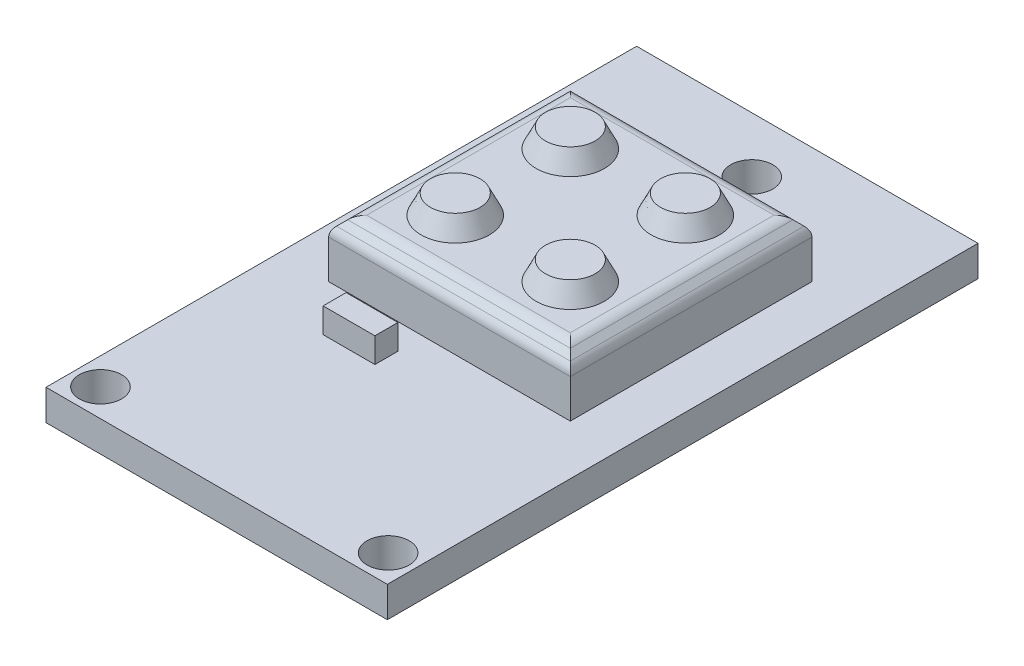
ISO-10303-21;
HEADER;
FILE_DESCRIPTION(('STEP AP214'),'2;1');
FILE_NAME('part.step','',(''),(''),'','','');
FILE_SCHEMA(('AUTOMOTIVE_DESIGN { 1 0 10303 214 1 1 1 1 }'));
ENDSEC;
DATA;
#1=APPLICATION_CONTEXT('core data for automotive mechanical design processes');
#2=APPLICATION_PROTOCOL_DEFINITION('international standard','automotive_design',2000,#1);
#3=PRODUCT_CONTEXT('',#1,'mechanical');
#4=PRODUCT('Part','Part','',(#3));
#5=PRODUCT_RELATED_PRODUCT_CATEGORY('part','',(#4));
#6=PRODUCT_DEFINITION_FORMATION('','',#4);
#7=PRODUCT_DEFINITION_CONTEXT('part definition',#1,'design');
#8=PRODUCT_DEFINITION('design','',#6,#7);
#9=PRODUCT_DEFINITION_SHAPE('','',#8);
#10=(LENGTH_UNIT() NAMED_UNIT(*) SI_UNIT(.MILLI.,.METRE.));
#11=(NAMED_UNIT(*) PLANE_ANGLE_UNIT() SI_UNIT($,.RADIAN.));
#12=(NAMED_UNIT(*) SI_UNIT($,.STERADIAN.) SOLID_ANGLE_UNIT());
#13=UNCERTAINTY_MEASURE_WITH_UNIT(LENGTH_MEASURE(1.E-05),#10,'distance_accuracy_value','');
#14=(GEOMETRIC_REPRESENTATION_CONTEXT(3) GLOBAL_UNCERTAINTY_ASSIGNED_CONTEXT((#13)) GLOBAL_UNIT_ASSIGNED_CONTEXT((#10,
#11,#12)) REPRESENTATION_CONTEXT('',''));
#15=CARTESIAN_POINT('',(0.,0.,0.));
#16=DIRECTION('',(0.,0.,1.));
#17=DIRECTION('',(1.,0.,0.));
#18=AXIS2_PLACEMENT_3D('',#15,#16,#17);
#19=CARTESIAN_POINT('',(0.,0.,0.));
#20=DIRECTION('',(0.,1.,0.));
#21=DIRECTION('',(0.,0.,1.));
#22=AXIS2_PLACEMENT_3D('',#19,#20,#21);
#23=PLANE('',#22);
#24=CARTESIAN_POINT('',(1.5,0.,-1.54));
#25=DIRECTION('',(0.,1.,0.));
#26=DIRECTION('',(0.,0.,1.));
#27=AXIS2_PLACEMENT_3D('',#24,#25,#26);
#28=CIRCLE('',#27,1.1);
#29=CARTESIAN_POINT('',(1.5,0.,-0.440000000000001));
#30=VERTEX_POINT('',#29);
#31=EDGE_CURVE('E223',#30,#30,#28,.T.);
#32=ORIENTED_EDGE('',*,*,#31,.F.);
#33=EDGE_LOOP('',(#32));
#34=FACE_BOUND('',#33,.T.);
#35=CARTESIAN_POINT('',(9.,0.,-28.));
#36=DIRECTION('',(0.,1.,0.));
#37=DIRECTION('',(0.,0.,1.));
#38=AXIS2_PLACEMENT_3D('',#35,#36,#37);
#39=CIRCLE('',#38,1.1);
#40=CARTESIAN_POINT('',(9.,0.,-26.9));
#41=VERTEX_POINT('',#40);
#42=EDGE_CURVE('E227',#41,#41,#39,.T.);
#43=ORIENTED_EDGE('',*,*,#42,.F.);
#44=EDGE_LOOP('',(#43));
#45=FACE_BOUND('',#44,.T.);
#46=CARTESIAN_POINT('',(16.5,0.,-1.54));
#47=DIRECTION('',(0.,1.,0.));
#48=DIRECTION('',(0.,0.,1.));
#49=AXIS2_PLACEMENT_3D('',#46,#47,#48);
#50=CIRCLE('',#49,1.1);
#51=CARTESIAN_POINT('',(16.5,0.,-0.440000000000001));
#52=VERTEX_POINT('',#51);
#53=EDGE_CURVE('E212',#52,#52,#50,.T.);
#54=ORIENTED_EDGE('',*,*,#53,.F.);
#55=EDGE_LOOP('',(#54));
#56=FACE_BOUND('',#55,.T.);
#57=DIRECTION('',(0.,0.,-1.));
#58=VECTOR('',#57,1.);
#59=CARTESIAN_POINT('',(0.100000000000002,0.,-30.9));
#60=LINE('',#59,#58);
#61=CARTESIAN_POINT('',(0.0999999999999994,0.,-0.100000000000003));
#62=VERTEX_POINT('',#61);
#63=CARTESIAN_POINT('',(0.100000000000002,0.,-30.9));
#64=VERTEX_POINT('',#63);
#65=EDGE_CURVE('E253',#62,#64,#60,.T.);
#66=ORIENTED_EDGE('',*,*,#65,.F.);
#67=DIRECTION('',(-1.,0.,0.));
#68=VECTOR('',#67,1.);
#69=CARTESIAN_POINT('',(0.0999999999999994,0.,-0.100000000000003));
#70=LINE('',#69,#68);
#71=CARTESIAN_POINT('',(17.9,0.,-0.100000000000003));
#72=VERTEX_POINT('',#71);
#73=EDGE_CURVE('E243',#72,#62,#70,.T.);
#74=ORIENTED_EDGE('',*,*,#73,.F.);
#75=DIRECTION('',(0.,0.,1.));
#76=VECTOR('',#75,1.);
#77=CARTESIAN_POINT('',(17.9,0.,-30.9));
#78=LINE('',#77,#76);
#79=CARTESIAN_POINT('',(17.9,0.,-30.9));
#80=VERTEX_POINT('',#79);
#81=EDGE_CURVE('E261',#80,#72,#78,.T.);
#82=ORIENTED_EDGE('',*,*,#81,.F.);
#83=DIRECTION('',(1.,0.,0.));
#84=VECTOR('',#83,1.);
#85=CARTESIAN_POINT('',(0.100000000000002,0.,-30.9));
#86=LINE('',#85,#84);
#87=EDGE_CURVE('E257',#64,#80,#86,.T.);
#88=ORIENTED_EDGE('',*,*,#87,.F.);
#89=EDGE_LOOP('',(#66,#74,#82,#88));
#90=FACE_BOUND('',#89,.T.);
#91=DIRECTION('',(0.,0.,1.));
#92=VECTOR('',#91,1.);
#93=CARTESIAN_POINT('',(2.7,0.,-12.24));
#94=LINE('',#93,#92);
#95=CARTESIAN_POINT('',(2.69999999999999,0.,-24.84));
#96=VERTEX_POINT('',#95);
#97=CARTESIAN_POINT('',(2.7,0.,-12.24));
#98=VERTEX_POINT('',#97);
#99=EDGE_CURVE('E311',#96,#98,#94,.T.);
#100=ORIENTED_EDGE('',*,*,#99,.F.);
#101=DIRECTION('',(-1.,0.,0.));
#102=VECTOR('',#101,1.);
#103=CARTESIAN_POINT('',(2.69999999999999,0.,-24.84));
#104=LINE('',#103,#102);
#105=CARTESIAN_POINT('',(15.3,0.,-24.84));
#106=VERTEX_POINT('',#105);
#107=EDGE_CURVE('E323',#106,#96,#104,.T.);
#108=ORIENTED_EDGE('',*,*,#107,.F.);
#109=DIRECTION('',(0.,0.,-1.));
#110=VECTOR('',#109,1.);
#111=CARTESIAN_POINT('',(15.3,0.,-12.24));
#112=LINE('',#111,#110);
#113=CARTESIAN_POINT('',(15.3,0.,-12.24));
#114=VERTEX_POINT('',#113);
#115=EDGE_CURVE('E319',#114,#106,#112,.T.);
#116=ORIENTED_EDGE('',*,*,#115,.F.);
#117=DIRECTION('',(1.,0.,0.));
#118=VECTOR('',#117,1.);
#119=CARTESIAN_POINT('',(2.7,0.,-12.24));
#120=LINE('',#119,#118);
#121=EDGE_CURVE('E315',#98,#114,#120,.T.);
#122=ORIENTED_EDGE('',*,*,#121,.F.);
#123=EDGE_LOOP('',(#100,#108,#116,#122));
#124=FACE_BOUND('',#123,.T.);
#125=DIRECTION('',(1.,0.,0.));
#126=VECTOR('',#125,1.);
#127=CARTESIAN_POINT('',(4.95,0.,-9.7));
#128=LINE('',#127,#126);
#129=CARTESIAN_POINT('',(4.95,0.,-9.7));
#130=VERTEX_POINT('',#129);
#131=CARTESIAN_POINT('',(7.65,0.,-9.7));
#132=VERTEX_POINT('',#131);
#133=EDGE_CURVE('E974',#130,#132,#128,.T.);
#134=ORIENTED_EDGE('',*,*,#133,.F.);
#135=DIRECTION('',(0.,0.,1.));
#136=VECTOR('',#135,1.);
#137=CARTESIAN_POINT('',(4.95,0.,-10.9));
#138=LINE('',#137,#136);
#139=CARTESIAN_POINT('',(4.95,0.,-10.9));
#140=VERTEX_POINT('',#139);
#141=EDGE_CURVE('E204',#140,#130,#138,.T.);
#142=ORIENTED_EDGE('',*,*,#141,.F.);
#143=DIRECTION('',(-1.,0.,0.));
#144=VECTOR('',#143,1.);
#145=CARTESIAN_POINT('',(4.95,0.,-10.9));
#146=LINE('',#145,#144);
#147=CARTESIAN_POINT('',(7.65,0.,-10.9));
#148=VERTEX_POINT('',#147);
#149=EDGE_CURVE('E200',#148,#140,#146,.T.);
#150=ORIENTED_EDGE('',*,*,#149,.F.);
#151=DIRECTION('',(0.,0.,-1.));
#152=VECTOR('',#151,1.);
#153=CARTESIAN_POINT('',(7.65,0.,-10.9));
#154=LINE('',#153,#152);
#155=EDGE_CURVE('E977',#132,#148,#154,.T.);
#156=ORIENTED_EDGE('',*,*,#155,.F.);
#157=EDGE_LOOP('',(#134,#142,#150,#156));
#158=FACE_BOUND('',#157,.T.);
#159=ADVANCED_FACE('F50',(#34,#45,#56,#90,#124,#158),#23,.T.);
#160=CARTESIAN_POINT('',(2.7,1.3,-12.24));
#161=DIRECTION('',(1.,0.,0.));
#162=DIRECTION('',(0.,0.,-1.));
#163=AXIS2_PLACEMENT_3D('',#160,#161,#162);
#164=PLANE('',#163);
#165=DIRECTION('',(0.,-1.,0.));
#166=VECTOR('',#165,1.);
#167=CARTESIAN_POINT('',(2.7,1.3,-12.24));
#168=LINE('',#167,#166);
#169=CARTESIAN_POINT('',(2.7,2.01005050633883,-12.24));
#170=VERTEX_POINT('',#169);
#171=EDGE_CURVE('E336',#170,#98,#168,.T.);
#172=ORIENTED_EDGE('',*,*,#171,.F.);
#173=DIRECTION('',(0.,0.,1.));
#174=VECTOR('',#173,1.);
#175=CARTESIAN_POINT('',(2.69999999999999,2.01005050633883,-24.84));
#176=LINE('',#175,#174);
#177=CARTESIAN_POINT('',(2.69999999999999,2.01005050633883,-24.84));
#178=VERTEX_POINT('',#177);
#179=EDGE_CURVE('E379',#170,#178,#176,.F.);
#180=ORIENTED_EDGE('',*,*,#179,.T.);
#181=DIRECTION('',(0.,-1.,0.));
#182=VECTOR('',#181,1.);
#183=CARTESIAN_POINT('',(2.69999999999999,1.3,-24.84));
#184=LINE('',#183,#182);
#185=EDGE_CURVE('E327',#178,#96,#184,.T.);
#186=ORIENTED_EDGE('',*,*,#185,.T.);
#187=ORIENTED_EDGE('',*,*,#99,.T.);
#188=EDGE_LOOP('',(#172,#180,#186,#187));
#189=FACE_BOUND('',#188,.T.);
#190=ADVANCED_FACE('F476',(#189),#164,.F.);
#191=CARTESIAN_POINT('',(2.7,1.3,-12.24));
#192=DIRECTION('',(0.,0.,-1.));
#193=DIRECTION('',(-1.,0.,0.));
#194=AXIS2_PLACEMENT_3D('',#191,#192,#193);
#195=PLANE('',#194);
#196=DIRECTION('',(0.,-1.,0.));
#197=VECTOR('',#196,1.);
#198=CARTESIAN_POINT('',(15.3,1.3,-12.24));
#199=LINE('',#198,#197);
#200=CARTESIAN_POINT('',(15.3,2.01005050633883,-12.24));
#201=VERTEX_POINT('',#200);
#202=EDGE_CURVE('E333',#201,#114,#199,.T.);
#203=ORIENTED_EDGE('',*,*,#202,.F.);
#204=DIRECTION('',(1.,0.,0.));
#205=VECTOR('',#204,1.);
#206=CARTESIAN_POINT('',(2.7,2.01005050633883,-12.24));
#207=LINE('',#206,#205);
#208=EDGE_CURVE('E375',#201,#170,#207,.F.);
#209=ORIENTED_EDGE('',*,*,#208,.T.);
#210=ORIENTED_EDGE('',*,*,#171,.T.);
#211=ORIENTED_EDGE('',*,*,#121,.T.);
#212=EDGE_LOOP('',(#203,#209,#210,#211));
#213=FACE_BOUND('',#212,.T.);
#214=ADVANCED_FACE('F482',(#213),#195,.F.);
#215=CARTESIAN_POINT('',(15.3,1.3,-12.24));
#216=DIRECTION('',(-1.,0.,0.));
#217=DIRECTION('',(0.,0.,1.));
#218=AXIS2_PLACEMENT_3D('',#215,#216,#217);
#219=PLANE('',#218);
#220=DIRECTION('',(0.,-1.,0.));
#221=VECTOR('',#220,1.);
#222=CARTESIAN_POINT('',(15.3,1.3,-24.84));
#223=LINE('',#222,#221);
#224=CARTESIAN_POINT('',(15.3,2.01005050633883,-24.84));
#225=VERTEX_POINT('',#224);
#226=EDGE_CURVE('E330',#225,#106,#223,.T.);
#227=ORIENTED_EDGE('',*,*,#226,.F.);
#228=DIRECTION('',(0.,0.,-1.));
#229=VECTOR('',#228,1.);
#230=CARTESIAN_POINT('',(15.3,2.01005050633883,-12.24));
#231=LINE('',#230,#229);
#232=EDGE_CURVE('E13',#225,#201,#231,.F.);
#233=ORIENTED_EDGE('',*,*,#232,.T.);
#234=ORIENTED_EDGE('',*,*,#202,.T.);
#235=ORIENTED_EDGE('',*,*,#115,.T.);
#236=EDGE_LOOP('',(#227,#233,#234,#235));
#237=FACE_BOUND('',#236,.T.);
#238=ADVANCED_FACE('F532',(#237),#219,.F.);
#239=CARTESIAN_POINT('',(2.69999999999999,1.3,-24.84));
#240=DIRECTION('',(0.,0.,1.));
#241=DIRECTION('',(1.,0.,0.));
#242=AXIS2_PLACEMENT_3D('',#239,#240,#241);
#243=PLANE('',#242);
#244=ORIENTED_EDGE('',*,*,#185,.F.);
#245=DIRECTION('',(-1.,0.,0.));
#246=VECTOR('',#245,1.);
#247=CARTESIAN_POINT('',(15.3,2.01005050633883,-24.84));
#248=LINE('',#247,#246);
#249=EDGE_CURVE('E388',#178,#225,#248,.F.);
#250=ORIENTED_EDGE('',*,*,#249,.T.);
#251=ORIENTED_EDGE('',*,*,#226,.T.);
#252=ORIENTED_EDGE('',*,*,#107,.T.);
#253=EDGE_LOOP('',(#244,#250,#251,#252));
#254=FACE_BOUND('',#253,.T.);
#255=ADVANCED_FACE('F511',(#254),#243,.F.);
#256=CARTESIAN_POINT('',(0.,3.,0.));
#257=DIRECTION('',(0.,-1.,0.));
#258=DIRECTION('',(0.,0.,-1.));
#259=AXIS2_PLACEMENT_3D('',#256,#257,#258);
#260=PLANE('',#259);
#261=DIRECTION('',(0.,0.,-1.));
#262=VECTOR('',#261,1.);
#263=CARTESIAN_POINT('',(3.68994949366116,3.,-12.94));
#264=LINE('',#263,#262);
#265=CARTESIAN_POINT('',(3.68994949366116,3.,-23.8500505063388));
#266=VERTEX_POINT('',#265);
#267=CARTESIAN_POINT('',(3.68994949366116,3.,-13.2299494936612));
#268=VERTEX_POINT('',#267);
#269=EDGE_CURVE('E360',#266,#268,#264,.F.);
#270=ORIENTED_EDGE('',*,*,#269,.T.);
#271=DIRECTION('',(-1.,0.,0.));
#272=VECTOR('',#271,1.);
#273=CARTESIAN_POINT('',(14.6,3.,-13.2299494936612));
#274=LINE('',#273,#272);
#275=CARTESIAN_POINT('',(14.3100505063388,3.,-13.2299494936612));
#276=VERTEX_POINT('',#275);
#277=EDGE_CURVE('E363',#268,#276,#274,.F.);
#278=ORIENTED_EDGE('',*,*,#277,.T.);
#279=DIRECTION('',(0.,0.,1.));
#280=VECTOR('',#279,1.);
#281=CARTESIAN_POINT('',(14.3100505063388,3.,-24.14));
#282=LINE('',#281,#280);
#283=CARTESIAN_POINT('',(14.3100505063388,3.,-23.8500505063388));
#284=VERTEX_POINT('',#283);
#285=EDGE_CURVE('E295',#276,#284,#282,.F.);
#286=ORIENTED_EDGE('',*,*,#285,.T.);
#287=DIRECTION('',(1.,0.,0.));
#288=VECTOR('',#287,1.);
#289=CARTESIAN_POINT('',(3.39999999999999,3.,-23.8500505063388));
#290=LINE('',#289,#288);
#291=EDGE_CURVE('E357',#284,#266,#290,.F.);
#292=ORIENTED_EDGE('',*,*,#291,.T.);
#293=EDGE_LOOP('',(#270,#278,#286,#292));
#294=FACE_BOUND('',#293,.T.);
#295=CARTESIAN_POINT('',(6.,3.,-21.54));
#296=DIRECTION('',(0.,-1.,0.));
#297=DIRECTION('',(0.,0.,-1.));
#298=AXIS2_PLACEMENT_3D('',#295,#296,#297);
#299=CIRCLE('',#298,1.78148258856586);
#300=CARTESIAN_POINT('',(6.,3.,-23.3214825885659));
#301=VERTEX_POINT('',#300);
#302=EDGE_CURVE('E291',#301,#301,#299,.T.);
#303=ORIENTED_EDGE('',*,*,#302,.T.);
#304=EDGE_LOOP('',(#303));
#305=FACE_BOUND('',#304,.T.);
#306=CARTESIAN_POINT('',(12.,3.,-21.54));
#307=DIRECTION('',(0.,-1.,0.));
#308=DIRECTION('',(0.,0.,-1.));
#309=AXIS2_PLACEMENT_3D('',#306,#307,#308);
#310=CIRCLE('',#309,1.78148258856586);
#311=CARTESIAN_POINT('',(12.,3.,-23.3214825885659));
#312=VERTEX_POINT('',#311);
#313=EDGE_CURVE('E286',#312,#312,#310,.T.);
#314=ORIENTED_EDGE('',*,*,#313,.T.);
#315=EDGE_LOOP('',(#314));
#316=FACE_BOUND('',#315,.T.);
#317=CARTESIAN_POINT('',(12.,3.,-15.54));
#318=DIRECTION('',(0.,-1.,0.));
#319=DIRECTION('',(0.,0.,-1.));
#320=AXIS2_PLACEMENT_3D('',#317,#318,#319);
#321=CIRCLE('',#320,1.78148258856586);
#322=CARTESIAN_POINT('',(12.,3.,-17.3214825885659));
#323=VERTEX_POINT('',#322);
#324=EDGE_CURVE('E282',#323,#323,#321,.T.);
#325=ORIENTED_EDGE('',*,*,#324,.T.);
#326=EDGE_LOOP('',(#325));
#327=FACE_BOUND('',#326,.T.);
#328=CARTESIAN_POINT('',(6.,3.,-15.54));
#329=DIRECTION('',(0.,-1.,0.));
#330=DIRECTION('',(0.,0.,-1.));
#331=AXIS2_PLACEMENT_3D('',#328,#329,#330);
#332=CIRCLE('',#331,1.78148258856586);
#333=CARTESIAN_POINT('',(6.,3.,-17.3214825885659));
#334=VERTEX_POINT('',#333);
#335=EDGE_CURVE('E287',#334,#334,#332,.T.);
#336=ORIENTED_EDGE('',*,*,#335,.T.);
#337=EDGE_LOOP('',(#336));
#338=FACE_BOUND('',#337,.T.);
#339=ADVANCED_FACE('F461',(#294,#305,#316,#327,#338),#260,.F.);
#340=CARTESIAN_POINT('',(6.,4.,-15.54));
#341=DIRECTION('',(0.,-1.,0.));
#342=DIRECTION('',(0.,0.,-1.));
#343=AXIS2_PLACEMENT_3D('',#340,#341,#342);
#344=PLANE('',#343);
#345=CARTESIAN_POINT('',(6.,4.,-15.54));
#346=DIRECTION('',(0.,1.,0.));
#347=DIRECTION('',(0.,0.,-1.));
#348=AXIS2_PLACEMENT_3D('',#345,#346,#347);
#349=CIRCLE('',#348,1.29375);
#350=CARTESIAN_POINT('',(6.,4.,-16.83375));
#351=VERTEX_POINT('',#350);
#352=EDGE_CURVE('E281',#351,#351,#349,.T.);
#353=ORIENTED_EDGE('',*,*,#352,.T.);
#354=EDGE_LOOP('',(#353));
#355=FACE_BOUND('',#354,.T.);
#356=ADVANCED_FACE('F510',(#355),#344,.F.);
#357=CARTESIAN_POINT('',(6.,4.,-15.54));
#358=DIRECTION('',(0.,-1.,0.));
#359=DIRECTION('',(0.,0.,1.));
#360=AXIS2_PLACEMENT_3D('',#357,#358,#359);
#361=CONICAL_SURFACE('',#360,1.29375,0.453785605518527);
#362=ORIENTED_EDGE('',*,*,#352,.F.);
#363=EDGE_LOOP('',(#362));
#364=FACE_BOUND('',#363,.T.);
#365=ORIENTED_EDGE('',*,*,#335,.F.);
#366=EDGE_LOOP('',(#365));
#367=FACE_BOUND('',#366,.T.);
#368=ADVANCED_FACE('F514',(#364,#367),#361,.T.);
#369=CARTESIAN_POINT('',(12.,4.,-15.54));
#370=DIRECTION('',(0.,1.,0.));
#371=DIRECTION('',(0.,0.,1.));
#372=AXIS2_PLACEMENT_3D('',#369,#370,#371);
#373=PLANE('',#372);
#374=CARTESIAN_POINT('',(12.,4.,-15.54));
#375=DIRECTION('',(0.,1.,0.));
#376=DIRECTION('',(0.,0.,1.));
#377=AXIS2_PLACEMENT_3D('',#374,#375,#376);
#378=CIRCLE('',#377,1.29375);
#379=CARTESIAN_POINT('',(12.,4.,-14.24625));
#380=VERTEX_POINT('',#379);
#381=EDGE_CURVE('E299',#380,#380,#378,.T.);
#382=ORIENTED_EDGE('',*,*,#381,.T.);
#383=EDGE_LOOP('',(#382));
#384=FACE_BOUND('',#383,.T.);
#385=ADVANCED_FACE('F516',(#384),#373,.T.);
#386=CARTESIAN_POINT('',(12.,4.,-15.54));
#387=DIRECTION('',(0.,-1.,0.));
#388=DIRECTION('',(0.,0.,1.));
#389=AXIS2_PLACEMENT_3D('',#386,#387,#388);
#390=CONICAL_SURFACE('',#389,1.29375,0.453785605518527);
#391=ORIENTED_EDGE('',*,*,#381,.F.);
#392=EDGE_LOOP('',(#391));
#393=FACE_BOUND('',#392,.T.);
#394=ORIENTED_EDGE('',*,*,#324,.F.);
#395=EDGE_LOOP('',(#394));
#396=FACE_BOUND('',#395,.T.);
#397=ADVANCED_FACE('F519',(#393,#396),#390,.T.);
#398=CARTESIAN_POINT('',(12.,4.,-21.54));
#399=DIRECTION('',(0.,-1.,0.));
#400=DIRECTION('',(0.,0.,-1.));
#401=AXIS2_PLACEMENT_3D('',#398,#399,#400);
#402=PLANE('',#401);
#403=CARTESIAN_POINT('',(12.,4.,-21.54));
#404=DIRECTION('',(0.,1.,0.));
#405=DIRECTION('',(0.,0.,-1.));
#406=AXIS2_PLACEMENT_3D('',#403,#404,#405);
#407=CIRCLE('',#406,1.29375);
#408=CARTESIAN_POINT('',(12.,4.,-22.83375));
#409=VERTEX_POINT('',#408);
#410=EDGE_CURVE('E303',#409,#409,#407,.T.);
#411=ORIENTED_EDGE('',*,*,#410,.T.);
#412=EDGE_LOOP('',(#411));
#413=FACE_BOUND('',#412,.T.);
#414=ADVANCED_FACE('F521',(#413),#402,.F.);
#415=CARTESIAN_POINT('',(12.,4.,-21.54));
#416=DIRECTION('',(0.,-1.,0.));
#417=DIRECTION('',(0.,0.,1.));
#418=AXIS2_PLACEMENT_3D('',#415,#416,#417);
#419=CONICAL_SURFACE('',#418,1.29375,0.453785605518527);
#420=ORIENTED_EDGE('',*,*,#410,.F.);
#421=EDGE_LOOP('',(#420));
#422=FACE_BOUND('',#421,.T.);
#423=ORIENTED_EDGE('',*,*,#313,.F.);
#424=EDGE_LOOP('',(#423));
#425=FACE_BOUND('',#424,.T.);
#426=ADVANCED_FACE('F524',(#422,#425),#419,.T.);
#427=CARTESIAN_POINT('',(6.,4.,-21.54));
#428=DIRECTION('',(0.,1.,0.));
#429=DIRECTION('',(0.,0.,1.));
#430=AXIS2_PLACEMENT_3D('',#427,#428,#429);
#431=PLANE('',#430);
#432=CARTESIAN_POINT('',(6.,4.,-21.54));
#433=DIRECTION('',(0.,1.,0.));
#434=DIRECTION('',(0.,0.,1.));
#435=AXIS2_PLACEMENT_3D('',#432,#433,#434);
#436=CIRCLE('',#435,1.29375);
#437=CARTESIAN_POINT('',(6.,4.,-20.24625));
#438=VERTEX_POINT('',#437);
#439=EDGE_CURVE('E307',#438,#438,#436,.T.);
#440=ORIENTED_EDGE('',*,*,#439,.T.);
#441=EDGE_LOOP('',(#440));
#442=FACE_BOUND('',#441,.T.);
#443=ADVANCED_FACE('F526',(#442),#431,.T.);
#444=CARTESIAN_POINT('',(6.,4.,-21.54));
#445=DIRECTION('',(0.,-1.,0.));
#446=DIRECTION('',(0.,0.,1.));
#447=AXIS2_PLACEMENT_3D('',#444,#445,#446);
#448=CONICAL_SURFACE('',#447,1.29375,0.453785605518527);
#449=ORIENTED_EDGE('',*,*,#439,.F.);
#450=EDGE_LOOP('',(#449));
#451=FACE_BOUND('',#450,.T.);
#452=ORIENTED_EDGE('',*,*,#302,.F.);
#453=EDGE_LOOP('',(#452));
#454=FACE_BOUND('',#453,.T.);
#455=ADVANCED_FACE('F506',(#451,#454),#448,.T.);
#456=CARTESIAN_POINT('',(0.100000000000002,-1.6,-30.9));
#457=DIRECTION('',(1.,0.,0.));
#458=DIRECTION('',(0.,0.,-1.));
#459=AXIS2_PLACEMENT_3D('',#456,#457,#458);
#460=PLANE('',#459);
#461=ORIENTED_EDGE('',*,*,#65,.T.);
#462=DIRECTION('',(0.,1.,0.));
#463=VECTOR('',#462,1.);
#464=CARTESIAN_POINT('',(0.100000000000002,-1.6,-30.9));
#465=LINE('',#464,#463);
#466=CARTESIAN_POINT('',(0.100000000000002,-1.6,-30.9));
#467=VERTEX_POINT('',#466);
#468=EDGE_CURVE('E277',#467,#64,#465,.T.);
#469=ORIENTED_EDGE('',*,*,#468,.F.);
#470=DIRECTION('',(0.,0.,-1.));
#471=VECTOR('',#470,1.);
#472=CARTESIAN_POINT('',(0.100000000000002,-1.6,-30.9));
#473=LINE('',#472,#471);
#474=CARTESIAN_POINT('',(0.0999999999999994,-1.6,-0.100000000000003));
#475=VERTEX_POINT('',#474);
#476=EDGE_CURVE('E238',#475,#467,#473,.T.);
#477=ORIENTED_EDGE('',*,*,#476,.F.);
#478=DIRECTION('',(0.,1.,0.));
#479=VECTOR('',#478,1.);
#480=CARTESIAN_POINT('',(0.0999999999999994,-1.6,-0.100000000000003));
#481=LINE('',#480,#479);
#482=EDGE_CURVE('E252',#475,#62,#481,.T.);
#483=ORIENTED_EDGE('',*,*,#482,.T.);
#484=EDGE_LOOP('',(#461,#469,#477,#483));
#485=FACE_BOUND('',#484,.T.);
#486=ADVANCED_FACE('F502',(#485),#460,.F.);
#487=CARTESIAN_POINT('',(0.100000000000002,-1.6,-30.9));
#488=DIRECTION('',(0.,0.,1.));
#489=DIRECTION('',(1.,0.,0.));
#490=AXIS2_PLACEMENT_3D('',#487,#488,#489);
#491=PLANE('',#490);
#492=ORIENTED_EDGE('',*,*,#87,.T.);
#493=DIRECTION('',(0.,1.,0.));
#494=VECTOR('',#493,1.);
#495=CARTESIAN_POINT('',(17.9,-1.6,-30.9));
#496=LINE('',#495,#494);
#497=CARTESIAN_POINT('',(17.9,-1.6,-30.9));
#498=VERTEX_POINT('',#497);
#499=EDGE_CURVE('E273',#498,#80,#496,.T.);
#500=ORIENTED_EDGE('',*,*,#499,.F.);
#501=DIRECTION('',(1.,0.,0.));
#502=VECTOR('',#501,1.);
#503=CARTESIAN_POINT('',(0.100000000000002,-1.6,-30.9));
#504=LINE('',#503,#502);
#505=EDGE_CURVE('E242',#467,#498,#504,.T.);
#506=ORIENTED_EDGE('',*,*,#505,.F.);
#507=ORIENTED_EDGE('',*,*,#468,.T.);
#508=EDGE_LOOP('',(#492,#500,#506,#507));
#509=FACE_BOUND('',#508,.T.);
#510=ADVANCED_FACE('F498',(#509),#491,.F.);
#511=CARTESIAN_POINT('',(17.9,-1.6,-30.9));
#512=DIRECTION('',(-1.,0.,0.));
#513=DIRECTION('',(0.,0.,1.));
#514=AXIS2_PLACEMENT_3D('',#511,#512,#513);
#515=PLANE('',#514);
#516=ORIENTED_EDGE('',*,*,#81,.T.);
#517=DIRECTION('',(0.,1.,0.));
#518=VECTOR('',#517,1.);
#519=CARTESIAN_POINT('',(17.9,-1.6,-0.100000000000003));
#520=LINE('',#519,#518);
#521=CARTESIAN_POINT('',(17.9,-1.6,-0.100000000000003));
#522=VERTEX_POINT('',#521);
#523=EDGE_CURVE('E269',#522,#72,#520,.T.);
#524=ORIENTED_EDGE('',*,*,#523,.F.);
#525=DIRECTION('',(0.,0.,1.));
#526=VECTOR('',#525,1.);
#527=CARTESIAN_POINT('',(17.9,-1.6,-30.9));
#528=LINE('',#527,#526);
#529=EDGE_CURVE('E246',#498,#522,#528,.T.);
#530=ORIENTED_EDGE('',*,*,#529,.F.);
#531=ORIENTED_EDGE('',*,*,#499,.T.);
#532=EDGE_LOOP('',(#516,#524,#530,#531));
#533=FACE_BOUND('',#532,.T.);
#534=ADVANCED_FACE('F494',(#533),#515,.F.);
#535=CARTESIAN_POINT('',(0.0999999999999994,-1.6,-0.100000000000003));
#536=DIRECTION('',(0.,0.,-1.));
#537=DIRECTION('',(-1.,0.,0.));
#538=AXIS2_PLACEMENT_3D('',#535,#536,#537);
#539=PLANE('',#538);
#540=ORIENTED_EDGE('',*,*,#73,.T.);
#541=ORIENTED_EDGE('',*,*,#482,.F.);
#542=DIRECTION('',(-1.,0.,0.));
#543=VECTOR('',#542,1.);
#544=CARTESIAN_POINT('',(0.0999999999999994,-1.6,-0.100000000000003));
#545=LINE('',#544,#543);
#546=EDGE_CURVE('E249',#522,#475,#545,.T.);
#547=ORIENTED_EDGE('',*,*,#546,.F.);
#548=ORIENTED_EDGE('',*,*,#523,.T.);
#549=EDGE_LOOP('',(#540,#541,#547,#548));
#550=FACE_BOUND('',#549,.T.);
#551=ADVANCED_FACE('F491',(#550),#539,.F.);
#552=CARTESIAN_POINT('',(0.,-1.6,0.));
#553=DIRECTION('',(0.,1.,0.));
#554=DIRECTION('',(0.,0.,1.));
#555=AXIS2_PLACEMENT_3D('',#552,#553,#554);
#556=PLANE('',#555);
#557=CARTESIAN_POINT('',(1.5,-1.6,-1.54));
#558=DIRECTION('',(0.,1.,0.));
#559=DIRECTION('',(0.,0.,1.));
#560=AXIS2_PLACEMENT_3D('',#557,#558,#559);
#561=CIRCLE('',#560,1.1);
#562=CARTESIAN_POINT('',(1.5,-1.6,-0.440000000000001));
#563=VERTEX_POINT('',#562);
#564=EDGE_CURVE('E218',#563,#563,#561,.T.);
#565=ORIENTED_EDGE('',*,*,#564,.T.);
#566=EDGE_LOOP('',(#565));
#567=FACE_BOUND('',#566,.T.);
#568=CARTESIAN_POINT('',(9.,-1.6,-28.));
#569=DIRECTION('',(0.,1.,0.));
#570=DIRECTION('',(0.,0.,1.));
#571=AXIS2_PLACEMENT_3D('',#568,#569,#570);
#572=CIRCLE('',#571,1.1);
#573=CARTESIAN_POINT('',(9.,-1.6,-26.9));
#574=VERTEX_POINT('',#573);
#575=EDGE_CURVE('E231',#574,#574,#572,.T.);
#576=ORIENTED_EDGE('',*,*,#575,.T.);
#577=EDGE_LOOP('',(#576));
#578=FACE_BOUND('',#577,.T.);
#579=CARTESIAN_POINT('',(16.5,-1.6,-1.54));
#580=DIRECTION('',(0.,1.,0.));
#581=DIRECTION('',(0.,0.,1.));
#582=AXIS2_PLACEMENT_3D('',#579,#580,#581);
#583=CIRCLE('',#582,1.1);
#584=CARTESIAN_POINT('',(16.5,-1.6,-0.440000000000001));
#585=VERTEX_POINT('',#584);
#586=EDGE_CURVE('E207',#585,#585,#583,.T.);
#587=ORIENTED_EDGE('',*,*,#586,.T.);
#588=EDGE_LOOP('',(#587));
#589=FACE_BOUND('',#588,.T.);
#590=ORIENTED_EDGE('',*,*,#476,.T.);
#591=ORIENTED_EDGE('',*,*,#505,.T.);
#592=ORIENTED_EDGE('',*,*,#529,.T.);
#593=ORIENTED_EDGE('',*,*,#546,.T.);
#594=EDGE_LOOP('',(#590,#591,#592,#593));
#595=FACE_BOUND('',#594,.T.);
#596=ADVANCED_FACE('F489',(#567,#578,#589,#595),#556,.F.);
#597=CARTESIAN_POINT('',(0.,3.,-24.14));
#598=DIRECTION('',(0.,-0.707106781186547,0.707106781186548));
#599=DIRECTION('',(-1.,0.,0.));
#600=AXIS2_PLACEMENT_3D('',#597,#598,#599);
#601=PLANE('',#600);
#602=DIRECTION('',(0.577350269189625,-0.577350269189626,-0.577350269189626));
#603=VECTOR('',#602,1.);
#604=CARTESIAN_POINT('',(9.73333333333334,7.86666666666667,-19.2733333333333));
#605=LINE('',#604,#603);
#606=CARTESIAN_POINT('',(15.0949747468306,2.50502525316942,-24.6349747468306));
#607=VERTEX_POINT('',#606);
#608=CARTESIAN_POINT('',(14.8050252531694,2.79497474683058,-24.3450252531694));
#609=VERTEX_POINT('',#608);
#610=EDGE_CURVE('E349',#607,#609,#605,.F.);
#611=ORIENTED_EDGE('',*,*,#610,.F.);
#612=DIRECTION('',(1.,0.,0.));
#613=VECTOR('',#612,1.);
#614=CARTESIAN_POINT('',(2.69999999999999,2.50502525316942,-24.6349747468306));
#615=LINE('',#614,#613);
#616=CARTESIAN_POINT('',(2.90502525316941,2.50502525316942,-24.6349747468306));
#617=VERTEX_POINT('',#616);
#618=EDGE_CURVE('E393',#607,#617,#615,.F.);
#619=ORIENTED_EDGE('',*,*,#618,.T.);
#620=DIRECTION('',(-0.577350269189626,-0.577350269189626,-0.577350269189625));
#621=VECTOR('',#620,1.);
#622=CARTESIAN_POINT('',(11.4466666666667,11.0466666666667,-16.0933333333333));
#623=LINE('',#622,#621);
#624=CARTESIAN_POINT('',(3.19497474683058,2.79497474683058,-24.3450252531694));
#625=VERTEX_POINT('',#624);
#626=EDGE_CURVE('E258',#625,#617,#623,.T.);
#627=ORIENTED_EDGE('',*,*,#626,.F.);
#628=DIRECTION('',(-1.,0.,0.));
#629=VECTOR('',#628,1.);
#630=CARTESIAN_POINT('',(14.6,2.79497474683058,-24.3450252531694));
#631=LINE('',#630,#629);
#632=EDGE_CURVE('E68',#625,#609,#631,.F.);
#633=ORIENTED_EDGE('',*,*,#632,.T.);
#634=EDGE_LOOP('',(#611,#619,#627,#633));
#635=FACE_BOUND('',#634,.T.);
#636=ADVANCED_FACE('F436',(#635),#601,.F.);
#637=CARTESIAN_POINT('',(3.4,3.,0.));
#638=DIRECTION('',(0.707106781186547,-0.707106781186547,0.));
#639=DIRECTION('',(0.,0.,1.));
#640=AXIS2_PLACEMENT_3D('',#637,#638,#639);
#641=PLANE('',#640);
#642=ORIENTED_EDGE('',*,*,#626,.T.);
#643=DIRECTION('',(0.,0.,-1.));
#644=VECTOR('',#643,1.);
#645=CARTESIAN_POINT('',(2.90502525316941,2.50502525316942,-12.24));
#646=LINE('',#645,#644);
#647=CARTESIAN_POINT('',(2.90502525316941,2.50502525316942,-12.4450252531694));
#648=VERTEX_POINT('',#647);
#649=EDGE_CURVE('E385',#617,#648,#646,.F.);
#650=ORIENTED_EDGE('',*,*,#649,.T.);
#651=DIRECTION('',(0.577350269189626,0.577350269189626,-0.577350269189626));
#652=VECTOR('',#651,1.);
#653=CARTESIAN_POINT('',(-0.913333333333338,-1.31333333333333,-8.62666666666667));
#654=LINE('',#653,#652);
#655=CARTESIAN_POINT('',(3.19497474683058,2.79497474683058,-12.7349747468306));
#656=VERTEX_POINT('',#655);
#657=EDGE_CURVE('E345',#656,#648,#654,.F.);
#658=ORIENTED_EDGE('',*,*,#657,.F.);
#659=DIRECTION('',(0.,0.,1.));
#660=VECTOR('',#659,1.);
#661=CARTESIAN_POINT('',(3.19497474683058,2.79497474683058,-24.14));
#662=LINE('',#661,#660);
#663=EDGE_CURVE('E382',#656,#625,#662,.F.);
#664=ORIENTED_EDGE('',*,*,#663,.T.);
#665=EDGE_LOOP('',(#642,#650,#658,#664));
#666=FACE_BOUND('',#665,.T.);
#667=ADVANCED_FACE('F438',(#666),#641,.F.);
#668=CARTESIAN_POINT('',(14.6,3.,0.));
#669=DIRECTION('',(-0.707106781186548,-0.707106781186547,0.));
#670=DIRECTION('',(0.,0.,-1.));
#671=AXIS2_PLACEMENT_3D('',#668,#669,#670);
#672=PLANE('',#671);
#673=ORIENTED_EDGE('',*,*,#610,.T.);
#674=DIRECTION('',(0.,0.,-1.));
#675=VECTOR('',#674,1.);
#676=CARTESIAN_POINT('',(14.8050252531694,2.79497474683058,-12.94));
#677=LINE('',#676,#675);
#678=CARTESIAN_POINT('',(14.8050252531694,2.79497474683058,-12.7349747468306));
#679=VERTEX_POINT('',#678);
#680=EDGE_CURVE('E60',#609,#679,#677,.F.);
#681=ORIENTED_EDGE('',*,*,#680,.T.);
#682=DIRECTION('',(0.577350269189625,-0.577350269189626,0.577350269189626));
#683=VECTOR('',#682,1.);
#684=CARTESIAN_POINT('',(18.9133333333333,-1.31333333333334,-8.62666666666667));
#685=LINE('',#684,#683);
#686=CARTESIAN_POINT('',(15.0949747468306,2.50502525316941,-12.4450252531694));
#687=VERTEX_POINT('',#686);
#688=EDGE_CURVE('E222',#687,#679,#685,.F.);
#689=ORIENTED_EDGE('',*,*,#688,.F.);
#690=DIRECTION('',(0.,0.,1.));
#691=VECTOR('',#690,1.);
#692=CARTESIAN_POINT('',(15.0949747468306,2.50502525316942,-24.84));
#693=LINE('',#692,#691);
#694=EDGE_CURVE('E75',#687,#607,#693,.F.);
#695=ORIENTED_EDGE('',*,*,#694,.T.);
#696=EDGE_LOOP('',(#673,#681,#689,#695));
#697=FACE_BOUND('',#696,.T.);
#698=ADVANCED_FACE('F559',(#697),#672,.F.);
#699=CARTESIAN_POINT('',(0.,3.,-12.94));
#700=DIRECTION('',(0.,-0.707106781186547,-0.707106781186548));
#701=DIRECTION('',(1.,0.,0.));
#702=AXIS2_PLACEMENT_3D('',#699,#700,#701);
#703=PLANE('',#702);
#704=ORIENTED_EDGE('',*,*,#688,.T.);
#705=DIRECTION('',(1.,0.,0.));
#706=VECTOR('',#705,1.);
#707=CARTESIAN_POINT('',(3.4,2.79497474683059,-12.7349747468306));
#708=LINE('',#707,#706);
#709=EDGE_CURVE('E371',#679,#656,#708,.F.);
#710=ORIENTED_EDGE('',*,*,#709,.T.);
#711=ORIENTED_EDGE('',*,*,#657,.T.);
#712=DIRECTION('',(-1.,0.,0.));
#713=VECTOR('',#712,1.);
#714=CARTESIAN_POINT('',(15.3,2.50502525316942,-12.4450252531694));
#715=LINE('',#714,#713);
#716=EDGE_CURVE('E367',#648,#687,#715,.F.);
#717=ORIENTED_EDGE('',*,*,#716,.T.);
#718=EDGE_LOOP('',(#704,#710,#711,#717));
#719=FACE_BOUND('',#718,.T.);
#720=ADVANCED_FACE('F449',(#719),#703,.F.);
#721=CARTESIAN_POINT('',(16.5,-1.6,-1.54));
#722=DIRECTION('',(0.,1.,0.));
#723=DIRECTION('',(0.,0.,1.));
#724=AXIS2_PLACEMENT_3D('',#721,#722,#723);
#725=CYLINDRICAL_SURFACE('',#724,1.1);
#726=ORIENTED_EDGE('',*,*,#586,.F.);
#727=EDGE_LOOP('',(#726));
#728=FACE_BOUND('',#727,.T.);
#729=ORIENTED_EDGE('',*,*,#53,.T.);
#730=EDGE_LOOP('',(#729));
#731=FACE_BOUND('',#730,.T.);
#732=ADVANCED_FACE('F558',(#728,#731),#725,.F.);
#733=CARTESIAN_POINT('',(9.,-1.6,-28.));
#734=DIRECTION('',(0.,1.,0.));
#735=DIRECTION('',(0.,0.,1.));
#736=AXIS2_PLACEMENT_3D('',#733,#734,#735);
#737=CYLINDRICAL_SURFACE('',#736,1.1);
#738=ORIENTED_EDGE('',*,*,#575,.F.);
#739=EDGE_LOOP('',(#738));
#740=FACE_BOUND('',#739,.T.);
#741=ORIENTED_EDGE('',*,*,#42,.T.);
#742=EDGE_LOOP('',(#741));
#743=FACE_BOUND('',#742,.T.);
#744=ADVANCED_FACE('F708',(#740,#743),#737,.F.);
#745=CARTESIAN_POINT('',(1.5,-1.6,-1.54));
#746=DIRECTION('',(0.,1.,0.));
#747=DIRECTION('',(0.,0.,1.));
#748=AXIS2_PLACEMENT_3D('',#745,#746,#747);
#749=CYLINDRICAL_SURFACE('',#748,1.1);
#750=ORIENTED_EDGE('',*,*,#564,.F.);
#751=EDGE_LOOP('',(#750));
#752=FACE_BOUND('',#751,.T.);
#753=ORIENTED_EDGE('',*,*,#31,.T.);
#754=EDGE_LOOP('',(#753));
#755=FACE_BOUND('',#754,.T.);
#756=ADVANCED_FACE('F693',(#752,#755),#749,.F.);
#757=CARTESIAN_POINT('',(4.95,1.3,-10.9));
#758=DIRECTION('',(1.,0.,0.));
#759=DIRECTION('',(0.,0.,-1.));
#760=AXIS2_PLACEMENT_3D('',#757,#758,#759);
#761=PLANE('',#760);
#762=ORIENTED_EDGE('',*,*,#141,.T.);
#763=DIRECTION('',(0.,-1.,0.));
#764=VECTOR('',#763,1.);
#765=CARTESIAN_POINT('',(4.95,1.3,-9.7));
#766=LINE('',#765,#764);
#767=CARTESIAN_POINT('',(4.95,1.3,-9.7));
#768=VERTEX_POINT('',#767);
#769=EDGE_CURVE('E182',#768,#130,#766,.T.);
#770=ORIENTED_EDGE('',*,*,#769,.F.);
#771=DIRECTION('',(0.,0.,1.));
#772=VECTOR('',#771,1.);
#773=CARTESIAN_POINT('',(4.95,1.3,-10.9));
#774=LINE('',#773,#772);
#775=CARTESIAN_POINT('',(4.95,1.3,-10.9));
#776=VERTEX_POINT('',#775);
#777=EDGE_CURVE('E190',#776,#768,#774,.T.);
#778=ORIENTED_EDGE('',*,*,#777,.F.);
#779=DIRECTION('',(0.,-1.,0.));
#780=VECTOR('',#779,1.);
#781=CARTESIAN_POINT('',(4.95,1.3,-10.9));
#782=LINE('',#781,#780);
#783=EDGE_CURVE('E988',#776,#140,#782,.T.);
#784=ORIENTED_EDGE('',*,*,#783,.T.);
#785=EDGE_LOOP('',(#762,#770,#778,#784));
#786=FACE_BOUND('',#785,.T.);
#787=ADVANCED_FACE('F202',(#786),#761,.F.);
#788=CARTESIAN_POINT('',(4.95,1.3,-9.7));
#789=DIRECTION('',(0.,0.,-1.));
#790=DIRECTION('',(-1.,0.,0.));
#791=AXIS2_PLACEMENT_3D('',#788,#789,#790);
#792=PLANE('',#791);
#793=ORIENTED_EDGE('',*,*,#133,.T.);
#794=DIRECTION('',(0.,-1.,0.));
#795=VECTOR('',#794,1.);
#796=CARTESIAN_POINT('',(7.65,1.3,-9.7));
#797=LINE('',#796,#795);
#798=CARTESIAN_POINT('',(7.65,1.3,-9.7));
#799=VERTEX_POINT('',#798);
#800=EDGE_CURVE('E185',#799,#132,#797,.T.);
#801=ORIENTED_EDGE('',*,*,#800,.F.);
#802=DIRECTION('',(1.,0.,0.));
#803=VECTOR('',#802,1.);
#804=CARTESIAN_POINT('',(4.95,1.3,-9.7));
#805=LINE('',#804,#803);
#806=EDGE_CURVE('E178',#768,#799,#805,.T.);
#807=ORIENTED_EDGE('',*,*,#806,.F.);
#808=ORIENTED_EDGE('',*,*,#769,.T.);
#809=EDGE_LOOP('',(#793,#801,#807,#808));
#810=FACE_BOUND('',#809,.T.);
#811=ADVANCED_FACE('F180',(#810),#792,.F.);
#812=CARTESIAN_POINT('',(7.65,1.3,-10.9));
#813=DIRECTION('',(-1.,0.,0.));
#814=DIRECTION('',(0.,0.,1.));
#815=AXIS2_PLACEMENT_3D('',#812,#813,#814);
#816=PLANE('',#815);
#817=ORIENTED_EDGE('',*,*,#155,.T.);
#818=DIRECTION('',(0.,-1.,0.));
#819=VECTOR('',#818,1.);
#820=CARTESIAN_POINT('',(7.65,1.3,-10.9));
#821=LINE('',#820,#819);
#822=CARTESIAN_POINT('',(7.65,1.3,-10.9));
#823=VERTEX_POINT('',#822);
#824=EDGE_CURVE('E214',#823,#148,#821,.T.);
#825=ORIENTED_EDGE('',*,*,#824,.F.);
#826=DIRECTION('',(0.,0.,-1.));
#827=VECTOR('',#826,1.);
#828=CARTESIAN_POINT('',(7.65,1.3,-10.9));
#829=LINE('',#828,#827);
#830=EDGE_CURVE('E189',#799,#823,#829,.T.);
#831=ORIENTED_EDGE('',*,*,#830,.F.);
#832=ORIENTED_EDGE('',*,*,#800,.T.);
#833=EDGE_LOOP('',(#817,#825,#831,#832));
#834=FACE_BOUND('',#833,.T.);
#835=ADVANCED_FACE('F663',(#834),#816,.F.);
#836=CARTESIAN_POINT('',(4.95,1.3,-10.9));
#837=DIRECTION('',(0.,0.,1.));
#838=DIRECTION('',(1.,0.,0.));
#839=AXIS2_PLACEMENT_3D('',#836,#837,#838);
#840=PLANE('',#839);
#841=ORIENTED_EDGE('',*,*,#149,.T.);
#842=ORIENTED_EDGE('',*,*,#783,.F.);
#843=DIRECTION('',(-1.,0.,0.));
#844=VECTOR('',#843,1.);
#845=CARTESIAN_POINT('',(4.95,1.3,-10.9));
#846=LINE('',#845,#844);
#847=EDGE_CURVE('E195',#823,#776,#846,.T.);
#848=ORIENTED_EDGE('',*,*,#847,.F.);
#849=ORIENTED_EDGE('',*,*,#824,.T.);
#850=EDGE_LOOP('',(#841,#842,#848,#849));
#851=FACE_BOUND('',#850,.T.);
#852=ADVANCED_FACE('F472',(#851),#840,.F.);
#853=CARTESIAN_POINT('',(0.,1.3,0.));
#854=DIRECTION('',(0.,1.,0.));
#855=DIRECTION('',(0.,0.,1.));
#856=AXIS2_PLACEMENT_3D('',#853,#854,#855);
#857=PLANE('',#856);
#858=ORIENTED_EDGE('',*,*,#777,.T.);
#859=ORIENTED_EDGE('',*,*,#806,.T.);
#860=ORIENTED_EDGE('',*,*,#830,.T.);
#861=ORIENTED_EDGE('',*,*,#847,.T.);
#862=EDGE_LOOP('',(#858,#859,#860,#861));
#863=FACE_BOUND('',#862,.T.);
#864=ADVANCED_FACE('F193',(#863),#857,.T.);
#865=CARTESIAN_POINT('',(0.,2.3,-23.8500505063388));
#866=DIRECTION('',(-1.,0.,0.));
#867=DIRECTION('',(0.,0.,1.));
#868=AXIS2_PLACEMENT_3D('',#865,#866,#867);
#869=CYLINDRICAL_SURFACE('',#868,0.7);
#870=CARTESIAN_POINT('',(14.3100505063388,2.3,-23.8500505063388));
#871=DIRECTION('',(-0.707106781186548,0.,-0.707106781186547));
#872=DIRECTION('',(0.707106781186547,0.,-0.707106781186548));
#873=AXIS2_PLACEMENT_3D('',#870,#871,#872);
#874=ELLIPSE('',#873,0.989949493661166,0.7);
#875=EDGE_CURVE('E406',#609,#284,#874,.F.);
#876=ORIENTED_EDGE('',*,*,#875,.F.);
#877=ORIENTED_EDGE('',*,*,#632,.F.);
#878=CARTESIAN_POINT('',(3.68994949366116,2.3,-23.8500505063388));
#879=DIRECTION('',(-0.707106781186547,0.,0.707106781186548));
#880=DIRECTION('',(-0.707106781186547,0.,-0.707106781186547));
#881=AXIS2_PLACEMENT_3D('',#878,#879,#880);
#882=ELLIPSE('',#881,0.989949493661167,0.7);
#883=EDGE_CURVE('E410',#266,#625,#882,.T.);
#884=ORIENTED_EDGE('',*,*,#883,.F.);
#885=ORIENTED_EDGE('',*,*,#291,.F.);
#886=EDGE_LOOP('',(#876,#877,#884,#885));
#887=FACE_BOUND('',#886,.T.);
#888=ADVANCED_FACE('F464',(#887),#869,.T.);
#889=CARTESIAN_POINT('',(3.68994949366116,2.3,0.));
#890=DIRECTION('',(0.,0.,1.));
#891=DIRECTION('',(1.,0.,0.));
#892=AXIS2_PLACEMENT_3D('',#889,#890,#891);
#893=CYLINDRICAL_SURFACE('',#892,0.7);
#894=ORIENTED_EDGE('',*,*,#883,.T.);
#895=ORIENTED_EDGE('',*,*,#663,.F.);
#896=CARTESIAN_POINT('',(3.68994949366116,2.3,-13.2299494936612));
#897=DIRECTION('',(0.707106781186548,0.,0.707106781186547));
#898=DIRECTION('',(-0.707106781186547,0.,0.707106781186548));
#899=AXIS2_PLACEMENT_3D('',#896,#897,#898);
#900=ELLIPSE('',#899,0.989949493661167,0.7);
#901=EDGE_CURVE('E403',#268,#656,#900,.T.);
#902=ORIENTED_EDGE('',*,*,#901,.F.);
#903=ORIENTED_EDGE('',*,*,#269,.F.);
#904=EDGE_LOOP('',(#894,#895,#902,#903));
#905=FACE_BOUND('',#904,.T.);
#906=ADVANCED_FACE('F443',(#905),#893,.T.);
#907=CARTESIAN_POINT('',(14.3100505063388,2.3,0.));
#908=DIRECTION('',(0.,0.,-1.));
#909=DIRECTION('',(-1.,0.,0.));
#910=AXIS2_PLACEMENT_3D('',#907,#908,#909);
#911=CYLINDRICAL_SURFACE('',#910,0.7);
#912=ORIENTED_EDGE('',*,*,#875,.T.);
#913=ORIENTED_EDGE('',*,*,#285,.F.);
#914=CARTESIAN_POINT('',(14.3100505063388,2.3,-13.2299494936612));
#915=DIRECTION('',(0.707106781186547,0.,-0.707106781186548));
#916=DIRECTION('',(-0.707106781186548,0.,-0.707106781186547));
#917=AXIS2_PLACEMENT_3D('',#914,#915,#916);
#918=ELLIPSE('',#917,0.989949493661167,0.7);
#919=EDGE_CURVE('E400',#679,#276,#918,.F.);
#920=ORIENTED_EDGE('',*,*,#919,.F.);
#921=ORIENTED_EDGE('',*,*,#680,.F.);
#922=EDGE_LOOP('',(#912,#913,#920,#921));
#923=FACE_BOUND('',#922,.T.);
#924=ADVANCED_FACE('F457',(#923),#911,.T.);
#925=CARTESIAN_POINT('',(0.,2.3,-13.2299494936612));
#926=DIRECTION('',(1.,0.,0.));
#927=DIRECTION('',(0.,0.,-1.));
#928=AXIS2_PLACEMENT_3D('',#925,#926,#927);
#929=CYLINDRICAL_SURFACE('',#928,0.7);
#930=ORIENTED_EDGE('',*,*,#901,.T.);
#931=ORIENTED_EDGE('',*,*,#709,.F.);
#932=ORIENTED_EDGE('',*,*,#919,.T.);
#933=ORIENTED_EDGE('',*,*,#277,.F.);
#934=EDGE_LOOP('',(#930,#931,#932,#933));
#935=FACE_BOUND('',#934,.T.);
#936=ADVANCED_FACE('F453',(#935),#929,.T.);
#937=CARTESIAN_POINT('',(2.69999999999999,2.01005050633883,-24.14));
#938=DIRECTION('',(1.,0.,0.));
#939=DIRECTION('',(0.,0.,-1.));
#940=AXIS2_PLACEMENT_3D('',#937,#938,#939);
#941=CYLINDRICAL_SURFACE('',#940,0.7);
#942=CARTESIAN_POINT('',(3.39999999999999,2.01005050633883,-24.14));
#943=DIRECTION('',(0.707106781186547,0.,-0.707106781186548));
#944=DIRECTION('',(0.707106781186547,0.,0.707106781186547));
#945=AXIS2_PLACEMENT_3D('',#942,#943,#944);
#946=ELLIPSE('',#945,0.989949493661167,0.7);
#947=EDGE_CURVE('E419',#617,#178,#946,.F.);
#948=ORIENTED_EDGE('',*,*,#947,.F.);
#949=ORIENTED_EDGE('',*,*,#618,.F.);
#950=CARTESIAN_POINT('',(14.6,2.01005050633883,-24.14));
#951=DIRECTION('',(0.707106781186548,0.,0.707106781186547));
#952=DIRECTION('',(-0.707106781186547,0.,0.707106781186548));
#953=AXIS2_PLACEMENT_3D('',#950,#951,#952);
#954=ELLIPSE('',#953,0.989949493661166,0.7);
#955=EDGE_CURVE('E54',#225,#607,#954,.T.);
#956=ORIENTED_EDGE('',*,*,#955,.F.);
#957=ORIENTED_EDGE('',*,*,#249,.F.);
#958=EDGE_LOOP('',(#948,#949,#956,#957));
#959=FACE_BOUND('',#958,.T.);
#960=ADVANCED_FACE('F52',(#959),#941,.T.);
#961=CARTESIAN_POINT('',(14.6,2.01005050633883,-12.24));
#962=DIRECTION('',(0.,0.,1.));
#963=DIRECTION('',(1.,0.,0.));
#964=AXIS2_PLACEMENT_3D('',#961,#962,#963);
#965=CYLINDRICAL_SURFACE('',#964,0.7);
#966=ORIENTED_EDGE('',*,*,#955,.T.);
#967=ORIENTED_EDGE('',*,*,#694,.F.);
#968=CARTESIAN_POINT('',(14.6,2.01005050633883,-12.94));
#969=DIRECTION('',(-0.707106781186547,0.,0.707106781186548));
#970=DIRECTION('',(0.707106781186548,0.,0.707106781186547));
#971=AXIS2_PLACEMENT_3D('',#968,#969,#970);
#972=ELLIPSE('',#971,0.989949493661167,0.7);
#973=EDGE_CURVE('E417',#201,#687,#972,.T.);
#974=ORIENTED_EDGE('',*,*,#973,.F.);
#975=ORIENTED_EDGE('',*,*,#232,.F.);
#976=EDGE_LOOP('',(#966,#967,#974,#975));
#977=FACE_BOUND('',#976,.T.);
#978=ADVANCED_FACE('F431',(#977),#965,.T.);
#979=CARTESIAN_POINT('',(3.4,2.01005050633883,-12.24));
#980=DIRECTION('',(0.,0.,-1.));
#981=DIRECTION('',(-1.,0.,0.));
#982=AXIS2_PLACEMENT_3D('',#979,#980,#981);
#983=CYLINDRICAL_SURFACE('',#982,0.7);
#984=ORIENTED_EDGE('',*,*,#947,.T.);
#985=ORIENTED_EDGE('',*,*,#179,.F.);
#986=CARTESIAN_POINT('',(3.4,2.01005050633883,-12.94));
#987=DIRECTION('',(-0.707106781186548,0.,-0.707106781186547));
#988=DIRECTION('',(0.707106781186547,0.,-0.707106781186548));
#989=AXIS2_PLACEMENT_3D('',#986,#987,#988);
#990=ELLIPSE('',#989,0.989949493661167,0.7);
#991=EDGE_CURVE('E414',#648,#170,#990,.F.);
#992=ORIENTED_EDGE('',*,*,#991,.F.);
#993=ORIENTED_EDGE('',*,*,#649,.F.);
#994=EDGE_LOOP('',(#984,#985,#992,#993));
#995=FACE_BOUND('',#994,.T.);
#996=ADVANCED_FACE('F596',(#995),#983,.T.);
#997=CARTESIAN_POINT('',(2.7,2.01005050633883,-12.94));
#998=DIRECTION('',(-1.,0.,0.));
#999=DIRECTION('',(0.,0.,1.));
#1000=AXIS2_PLACEMENT_3D('',#997,#998,#999);
#1001=CYLINDRICAL_SURFACE('',#1000,0.7);
#1002=ORIENTED_EDGE('',*,*,#973,.T.);
#1003=ORIENTED_EDGE('',*,*,#716,.F.);
#1004=ORIENTED_EDGE('',*,*,#991,.T.);
#1005=ORIENTED_EDGE('',*,*,#208,.F.);
#1006=EDGE_LOOP('',(#1002,#1003,#1004,#1005));
#1007=FACE_BOUND('',#1006,.T.);
#1008=ADVANCED_FACE('F602',(#1007),#1001,.T.);
#1009=CLOSED_SHELL('',(#159,#190,#214,#238,#255,#339,#356,#368,#385,#397,#414,#426,#443,#455,
#486,#510,#534,#551,#596,#636,#667,#698,#720,#732,#744,#756,#787,#811,#835,#852,#864,#888,#906,
#924,#936,#960,#978,#996,#1008));
#1010=MANIFOLD_SOLID_BREP('B2',#1009);
#1011=ADVANCED_BREP_SHAPE_REPRESENTATION('',(#18,#1010),#14);
#1012=SHAPE_DEFINITION_REPRESENTATION(#9,#1011);
ENDSEC;
END-ISO-10303-21;
